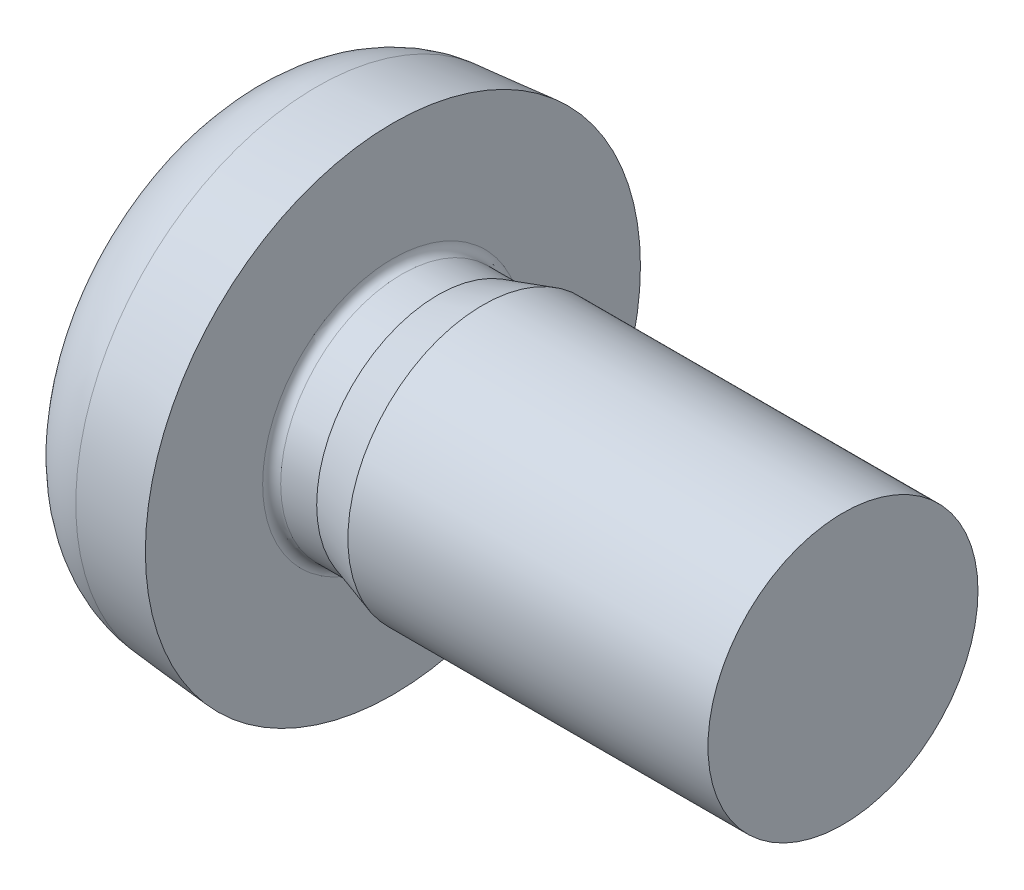
ISO-10303-21;
HEADER;
FILE_DESCRIPTION(('STEP AP214'),'2;1');
FILE_NAME('part.step','',(''),(''),'','','');
FILE_SCHEMA(('AUTOMOTIVE_DESIGN { 1 0 10303 214 1 1 1 1 }'));
ENDSEC;
DATA;
#1=APPLICATION_CONTEXT('core data for automotive mechanical design processes');
#2=APPLICATION_PROTOCOL_DEFINITION('international standard','automotive_design',2000,#1);
#3=PRODUCT_CONTEXT('',#1,'mechanical');
#4=PRODUCT('Part','Part','',(#3));
#5=PRODUCT_RELATED_PRODUCT_CATEGORY('part','',(#4));
#6=PRODUCT_DEFINITION_FORMATION('','',#4);
#7=PRODUCT_DEFINITION_CONTEXT('part definition',#1,'design');
#8=PRODUCT_DEFINITION('design','',#6,#7);
#9=PRODUCT_DEFINITION_SHAPE('','',#8);
#10=(LENGTH_UNIT() NAMED_UNIT(*) SI_UNIT(.MILLI.,.METRE.));
#11=(NAMED_UNIT(*) PLANE_ANGLE_UNIT() SI_UNIT($,.RADIAN.));
#12=(NAMED_UNIT(*) SI_UNIT($,.STERADIAN.) SOLID_ANGLE_UNIT());
#13=UNCERTAINTY_MEASURE_WITH_UNIT(LENGTH_MEASURE(1.E-05),#10,'distance_accuracy_value','');
#14=(GEOMETRIC_REPRESENTATION_CONTEXT(3) GLOBAL_UNCERTAINTY_ASSIGNED_CONTEXT((#13)) GLOBAL_UNIT_ASSIGNED_CONTEXT((#10,
#11,#12)) REPRESENTATION_CONTEXT('',''));
#15=CARTESIAN_POINT('',(0.,0.,0.));
#16=DIRECTION('',(0.,0.,1.));
#17=DIRECTION('',(1.,0.,0.));
#18=AXIS2_PLACEMENT_3D('',#15,#16,#17);
#19=CARTESIAN_POINT('',(-1.,0.,0.));
#20=DIRECTION('',(1.,0.,0.));
#21=DIRECTION('',(0.,0.,-1.));
#22=AXIS2_PLACEMENT_3D('',#19,#20,#21);
#23=PLANE('',#22);
#24=DIRECTION('',(0.,-1.,0.));
#25=VECTOR('',#24,1.);
#26=CARTESIAN_POINT('',(-1.,0.916666666666667,0.36666666666666));
#27=LINE('',#26,#25);
#28=CARTESIAN_POINT('',(-1.,0.916666666666667,0.36666666666666));
#29=VERTEX_POINT('',#28);
#30=CARTESIAN_POINT('',(-1.,1.8,0.36666666666666));
#31=VERTEX_POINT('',#30);
#32=EDGE_CURVE('E152',#29,#31,#27,.F.);
#33=ORIENTED_EDGE('',*,*,#32,.T.);
#34=DIRECTION('',(0.,0.,1.));
#35=VECTOR('',#34,1.);
#36=CARTESIAN_POINT('',(-1.,1.8,0.36666666666666));
#37=LINE('',#36,#35);
#38=CARTESIAN_POINT('',(-1.,1.8,-0.366666666666681));
#39=VERTEX_POINT('',#38);
#40=EDGE_CURVE('E147',#31,#39,#37,.F.);
#41=ORIENTED_EDGE('',*,*,#40,.T.);
#42=DIRECTION('',(0.,1.,0.));
#43=VECTOR('',#42,1.);
#44=CARTESIAN_POINT('',(-1.,1.8,-0.366666666666681));
#45=LINE('',#44,#43);
#46=CARTESIAN_POINT('',(-1.,0.916666666666666,-0.366666666666682));
#47=VERTEX_POINT('',#46);
#48=EDGE_CURVE('E149',#39,#47,#45,.F.);
#49=ORIENTED_EDGE('',*,*,#48,.T.);
#50=CARTESIAN_POINT('',(-1.,0.916666666666666,-0.916666666666681));
#51=DIRECTION('',(-1.,0.,0.));
#52=DIRECTION('',(0.,0.,1.));
#53=AXIS2_PLACEMENT_3D('',#50,#51,#52);
#54=CIRCLE('',#53,0.55);
#55=CARTESIAN_POINT('',(-1.,0.366666666666667,-0.916666666666682));
#56=VERTEX_POINT('',#55);
#57=EDGE_CURVE('E179',#56,#47,#54,.T.);
#58=ORIENTED_EDGE('',*,*,#57,.F.);
#59=DIRECTION('',(0.,0.,1.));
#60=VECTOR('',#59,1.);
#61=CARTESIAN_POINT('',(-1.,0.366666666666667,-0.916666666666681));
#62=LINE('',#61,#60);
#63=CARTESIAN_POINT('',(-1.,0.366666666666667,-1.8));
#64=VERTEX_POINT('',#63);
#65=EDGE_CURVE('E182',#56,#64,#62,.F.);
#66=ORIENTED_EDGE('',*,*,#65,.T.);
#67=DIRECTION('',(0.,1.,0.));
#68=VECTOR('',#67,1.);
#69=CARTESIAN_POINT('',(-1.,0.366666666666666,-1.8));
#70=LINE('',#69,#68);
#71=CARTESIAN_POINT('',(-1.,-0.366666666666667,-1.8));
#72=VERTEX_POINT('',#71);
#73=EDGE_CURVE('E129',#64,#72,#70,.F.);
#74=ORIENTED_EDGE('',*,*,#73,.T.);
#75=DIRECTION('',(0.,0.,-1.));
#76=VECTOR('',#75,1.);
#77=CARTESIAN_POINT('',(-1.,-0.366666666666667,-1.8));
#78=LINE('',#77,#76);
#79=CARTESIAN_POINT('',(-1.,-0.366666666666667,-0.916666666666681));
#80=VERTEX_POINT('',#79);
#81=EDGE_CURVE('E125',#72,#80,#78,.F.);
#82=ORIENTED_EDGE('',*,*,#81,.T.);
#83=CARTESIAN_POINT('',(-1.,-0.916666666666667,-0.916666666666681));
#84=DIRECTION('',(-1.,0.,0.));
#85=DIRECTION('',(0.,0.,1.));
#86=AXIS2_PLACEMENT_3D('',#83,#84,#85);
#87=CIRCLE('',#86,0.55);
#88=CARTESIAN_POINT('',(-1.,-0.916666666666667,-0.366666666666681));
#89=VERTEX_POINT('',#88);
#90=EDGE_CURVE('E21',#89,#80,#87,.T.);
#91=ORIENTED_EDGE('',*,*,#90,.F.);
#92=DIRECTION('',(0.,1.,0.));
#93=VECTOR('',#92,1.);
#94=CARTESIAN_POINT('',(-1.,-0.916666666666666,-0.366666666666681));
#95=LINE('',#94,#93);
#96=CARTESIAN_POINT('',(-1.,-1.8,-0.366666666666681));
#97=VERTEX_POINT('',#96);
#98=EDGE_CURVE('E133',#89,#97,#95,.F.);
#99=ORIENTED_EDGE('',*,*,#98,.T.);
#100=DIRECTION('',(0.,0.,-1.));
#101=VECTOR('',#100,1.);
#102=CARTESIAN_POINT('',(-1.,-1.8,-0.366666666666681));
#103=LINE('',#102,#101);
#104=CARTESIAN_POINT('',(-1.,-1.8,0.366666666666667));
#105=VERTEX_POINT('',#104);
#106=EDGE_CURVE('E137',#97,#105,#103,.F.);
#107=ORIENTED_EDGE('',*,*,#106,.T.);
#108=DIRECTION('',(0.,-1.,0.));
#109=VECTOR('',#108,1.);
#110=CARTESIAN_POINT('',(-1.,-1.8,0.366666666666667));
#111=LINE('',#110,#109);
#112=CARTESIAN_POINT('',(-1.,-0.916666666666668,0.366666666666667));
#113=VERTEX_POINT('',#112);
#114=EDGE_CURVE('E190',#105,#113,#111,.F.);
#115=ORIENTED_EDGE('',*,*,#114,.T.);
#116=CARTESIAN_POINT('',(-1.,-0.916666666666668,0.916666666666667));
#117=DIRECTION('',(-1.,0.,0.));
#118=DIRECTION('',(0.,0.,1.));
#119=AXIS2_PLACEMENT_3D('',#116,#117,#118);
#120=CIRCLE('',#119,0.55);
#121=CARTESIAN_POINT('',(-1.,-0.366666666666667,0.916666666666667));
#122=VERTEX_POINT('',#121);
#123=EDGE_CURVE('E328',#122,#113,#120,.T.);
#124=ORIENTED_EDGE('',*,*,#123,.F.);
#125=DIRECTION('',(0.,0.,-1.));
#126=VECTOR('',#125,1.);
#127=CARTESIAN_POINT('',(-1.,-0.366666666666667,0.916666666666667));
#128=LINE('',#127,#126);
#129=CARTESIAN_POINT('',(-1.,-0.366666666666667,1.8));
#130=VERTEX_POINT('',#129);
#131=EDGE_CURVE('E198',#122,#130,#128,.F.);
#132=ORIENTED_EDGE('',*,*,#131,.T.);
#133=DIRECTION('',(0.,1.,0.));
#134=VECTOR('',#133,1.);
#135=CARTESIAN_POINT('',(-1.,-0.366666666666667,1.8));
#136=LINE('',#135,#134);
#137=CARTESIAN_POINT('',(-1.,0.366666666666667,1.8));
#138=VERTEX_POINT('',#137);
#139=EDGE_CURVE('E202',#130,#138,#136,.T.);
#140=ORIENTED_EDGE('',*,*,#139,.T.);
#141=DIRECTION('',(0.,0.,1.));
#142=VECTOR('',#141,1.);
#143=CARTESIAN_POINT('',(-1.,0.366666666666667,1.8));
#144=LINE('',#143,#142);
#145=CARTESIAN_POINT('',(-1.,0.366666666666667,0.91666666666666));
#146=VERTEX_POINT('',#145);
#147=EDGE_CURVE('E205',#138,#146,#144,.F.);
#148=ORIENTED_EDGE('',*,*,#147,.T.);
#149=CARTESIAN_POINT('',(-1.,0.916666666666667,0.91666666666666));
#150=DIRECTION('',(-1.,0.,0.));
#151=DIRECTION('',(0.,0.,1.));
#152=AXIS2_PLACEMENT_3D('',#149,#150,#151);
#153=CIRCLE('',#152,0.55);
#154=EDGE_CURVE('E331',#29,#146,#153,.T.);
#155=ORIENTED_EDGE('',*,*,#154,.F.);
#156=EDGE_LOOP('',(#33,#41,#49,#58,#66,#74,#82,#91,#99,#107,#115,#124,#132,#140,#148,#155));
#157=FACE_BOUND('',#156,.T.);
#158=ADVANCED_FACE('F17',(#157),#23,.F.);
#159=CARTESIAN_POINT('',(-2.,-0.916666666666666,-0.366666666666681));
#160=DIRECTION('',(0.,0.,-1.));
#161=DIRECTION('',(0.,1.,0.));
#162=AXIS2_PLACEMENT_3D('',#159,#160,#161);
#163=PLANE('',#162);
#164=ORIENTED_EDGE('',*,*,#98,.F.);
#165=DIRECTION('',(-1.,0.,0.));
#166=VECTOR('',#165,1.);
#167=CARTESIAN_POINT('',(-2.,-0.916666666666667,-0.366666666666681));
#168=LINE('',#167,#166);
#169=CARTESIAN_POINT('',(-1.93002725664033,-0.916666666666667,-0.366666666666681));
#170=VERTEX_POINT('',#169);
#171=EDGE_CURVE('E187',#170,#89,#168,.F.);
#172=ORIENTED_EDGE('',*,*,#171,.F.);
#173=CARTESIAN_POINT('',(5.,0.,-0.366666666666682));
#174=DIRECTION('',(0.,0.,-1.));
#175=DIRECTION('',(0.,1.,0.));
#176=AXIS2_PLACEMENT_3D('',#173,#174,#175);
#177=CIRCLE('',#176,6.99039022913282);
#178=CARTESIAN_POINT('',(-1.75466916699521,-1.8,-0.366666666666681));
#179=VERTEX_POINT('',#178);
#180=EDGE_CURVE('E325',#179,#170,#177,.T.);
#181=ORIENTED_EDGE('',*,*,#180,.F.);
#182=DIRECTION('',(1.,0.,0.));
#183=VECTOR('',#182,1.);
#184=CARTESIAN_POINT('',(-2.,-1.8,-0.366666666666681));
#185=LINE('',#184,#183);
#186=EDGE_CURVE('E196',#179,#97,#185,.T.);
#187=ORIENTED_EDGE('',*,*,#186,.T.);
#188=EDGE_LOOP('',(#164,#172,#181,#187));
#189=FACE_BOUND('',#188,.T.);
#190=ADVANCED_FACE('F313',(#189),#163,.F.);
#191=CARTESIAN_POINT('',(-2.,-0.916666666666667,-0.916666666666681));
#192=DIRECTION('',(-1.,0.,0.));
#193=DIRECTION('',(0.,0.,1.));
#194=AXIS2_PLACEMENT_3D('',#191,#192,#193);
#195=CYLINDRICAL_SURFACE('',#194,0.55);
#196=CARTESIAN_POINT('',(-1.93002725664033,-0.916666666666667,-0.366666666666681));
#197=CARTESIAN_POINT('',(-1.93407227520159,-0.886112931984949,-0.366639615190067));
#198=CARTESIAN_POINT('',(-1.93777603133214,-0.855514124884462,-0.369211391563301));
#199=CARTESIAN_POINT('',(-1.94440928453483,-0.795093223472977,-0.379404826816264));
#200=CARTESIAN_POINT('',(-1.94733902252033,-0.765270890095668,-0.387024911812327));
#201=CARTESIAN_POINT('',(-1.95233727765501,-0.70722484857691,-0.40717597839749));
#202=CARTESIAN_POINT('',(-1.95440505540861,-0.679002530794038,-0.419711158378407));
#203=CARTESIAN_POINT('',(-1.9576137344238,-0.625019695178207,-0.449345372281648));
#204=CARTESIAN_POINT('',(-1.95875496666875,-0.599258301150878,-0.466442773571219));
#205=CARTESIAN_POINT('',(-1.96007037465317,-0.551169619490936,-0.504544762148184));
#206=CARTESIAN_POINT('',(-1.96025340503453,-0.528812748649267,-0.525511713742623));
#207=CARTESIAN_POINT('',(-1.95967070187186,-0.487888718635724,-0.570860022678963));
#208=CARTESIAN_POINT('',(-1.95890483538137,-0.469322090925454,-0.595241858043158));
#209=CARTESIAN_POINT('',(-1.95645267839,-0.436572958940025,-0.646603315629529));
#210=CARTESIAN_POINT('',(-1.95477018770261,-0.422372731585471,-0.673571837209157));
#211=CARTESIAN_POINT('',(-1.95053673130942,-0.39863303654964,-0.729421048067446));
#212=CARTESIAN_POINT('',(-1.94798604435116,-0.389092075331408,-0.758301121219216));
#213=CARTESIAN_POINT('',(-1.94292201050267,-0.376895672956433,-0.808864676990656));
#214=CARTESIAN_POINT('',(-1.94059943504869,-0.373058918267392,-0.830290913023339));
#215=CARTESIAN_POINT('',(-1.93558325865533,-0.36794402974454,-0.873372349629094));
#216=CARTESIAN_POINT('',(-1.93289019461072,-0.366662234278177,-0.895027177754611));
#217=CARTESIAN_POINT('',(-1.93002725664033,-0.366666666666667,-0.916666666666682));
#218=B_SPLINE_CURVE_WITH_KNOTS('',3,(#196,#197,#198,#199,#200,#201,#202,#203,#204,#205,#206,
#207,#208,#209,#210,#211,#212,#213,#214,#215,#216,#217),.UNSPECIFIED.,.F.,.F.,(4,2,2,2,2,2,2,2,
2,2,4),(0.,0.0923521249425688,0.184675471307177,0.27707785112806,0.369447208153474,
0.460961463533269,0.552488542089664,0.643639055842369,0.734760331907433,0.800285720426181,
0.865717133706987),.UNSPECIFIED.);
#219=CARTESIAN_POINT('',(-1.93002725664033,-0.366666666666667,-0.916666666666682));
#220=VERTEX_POINT('',#219);
#221=EDGE_CURVE('E316',#170,#220,#218,.T.);
#222=ORIENTED_EDGE('',*,*,#221,.F.);
#223=ORIENTED_EDGE('',*,*,#171,.T.);
#224=ORIENTED_EDGE('',*,*,#90,.T.);
#225=DIRECTION('',(1.,0.,0.));
#226=VECTOR('',#225,1.);
#227=CARTESIAN_POINT('',(-2.,-0.366666666666667,-0.916666666666681));
#228=LINE('',#227,#226);
#229=EDGE_CURVE('E185',#80,#220,#228,.F.);
#230=ORIENTED_EDGE('',*,*,#229,.T.);
#231=EDGE_LOOP('',(#222,#223,#224,#230));
#232=FACE_BOUND('',#231,.T.);
#233=ADVANCED_FACE('F308',(#232),#195,.T.);
#234=CARTESIAN_POINT('',(-2.,-0.366666666666667,-1.8));
#235=DIRECTION('',(0.,-1.,0.));
#236=DIRECTION('',(0.,0.,-1.));
#237=AXIS2_PLACEMENT_3D('',#234,#235,#236);
#238=PLANE('',#237);
#239=ORIENTED_EDGE('',*,*,#81,.F.);
#240=DIRECTION('',(-1.,0.,0.));
#241=VECTOR('',#240,1.);
#242=CARTESIAN_POINT('',(-2.,-0.366666666666667,-1.8));
#243=LINE('',#242,#241);
#244=CARTESIAN_POINT('',(-1.75466916699521,-0.366666666666667,-1.8));
#245=VERTEX_POINT('',#244);
#246=EDGE_CURVE('E183',#72,#245,#243,.T.);
#247=ORIENTED_EDGE('',*,*,#246,.T.);
#248=CARTESIAN_POINT('',(5.,-0.366666666666667,0.));
#249=DIRECTION('',(0.,-1.,0.));
#250=DIRECTION('',(0.,0.,-1.));
#251=AXIS2_PLACEMENT_3D('',#248,#249,#250);
#252=CIRCLE('',#251,6.99039022913282);
#253=EDGE_CURVE('E324',#220,#245,#252,.T.);
#254=ORIENTED_EDGE('',*,*,#253,.F.);
#255=ORIENTED_EDGE('',*,*,#229,.F.);
#256=EDGE_LOOP('',(#239,#247,#254,#255));
#257=FACE_BOUND('',#256,.T.);
#258=ADVANCED_FACE('F304',(#257),#238,.F.);
#259=CARTESIAN_POINT('',(-2.,0.366666666666666,-1.8));
#260=DIRECTION('',(0.,0.,-1.));
#261=DIRECTION('',(-1.,0.,0.));
#262=AXIS2_PLACEMENT_3D('',#259,#260,#261);
#263=PLANE('',#262);
#264=ORIENTED_EDGE('',*,*,#73,.F.);
#265=DIRECTION('',(1.,0.,0.));
#266=VECTOR('',#265,1.);
#267=CARTESIAN_POINT('',(-2.,0.366666666666667,-1.8));
#268=LINE('',#267,#266);
#269=CARTESIAN_POINT('',(-1.75466916699521,0.366666666666667,-1.8));
#270=VERTEX_POINT('',#269);
#271=EDGE_CURVE('E180',#64,#270,#268,.F.);
#272=ORIENTED_EDGE('',*,*,#271,.T.);
#273=CARTESIAN_POINT('',(5.,0.,-1.8));
#274=DIRECTION('',(0.,0.,-1.));
#275=DIRECTION('',(-1.,0.,0.));
#276=AXIS2_PLACEMENT_3D('',#273,#274,#275);
#277=CIRCLE('',#276,6.76461381011511);
#278=EDGE_CURVE('E341',#245,#270,#277,.T.);
#279=ORIENTED_EDGE('',*,*,#278,.F.);
#280=ORIENTED_EDGE('',*,*,#246,.F.);
#281=EDGE_LOOP('',(#264,#272,#279,#280));
#282=FACE_BOUND('',#281,.T.);
#283=ADVANCED_FACE('F300',(#282),#263,.F.);
#284=CARTESIAN_POINT('',(-2.,0.366666666666667,-0.916666666666681));
#285=DIRECTION('',(0.,1.,0.));
#286=DIRECTION('',(0.,0.,1.));
#287=AXIS2_PLACEMENT_3D('',#284,#285,#286);
#288=PLANE('',#287);
#289=ORIENTED_EDGE('',*,*,#65,.F.);
#290=DIRECTION('',(-1.,0.,0.));
#291=VECTOR('',#290,1.);
#292=CARTESIAN_POINT('',(-2.,0.366666666666667,-0.916666666666682));
#293=LINE('',#292,#291);
#294=CARTESIAN_POINT('',(-1.93002725664033,0.366666666666667,-0.916666666666682));
#295=VERTEX_POINT('',#294);
#296=EDGE_CURVE('E165',#295,#56,#293,.F.);
#297=ORIENTED_EDGE('',*,*,#296,.F.);
#298=CARTESIAN_POINT('',(5.,0.366666666666667,0.));
#299=DIRECTION('',(0.,1.,0.));
#300=DIRECTION('',(0.,0.,1.));
#301=AXIS2_PLACEMENT_3D('',#298,#299,#300);
#302=CIRCLE('',#301,6.99039022913282);
#303=EDGE_CURVE('E287',#270,#295,#302,.T.);
#304=ORIENTED_EDGE('',*,*,#303,.F.);
#305=ORIENTED_EDGE('',*,*,#271,.F.);
#306=EDGE_LOOP('',(#289,#297,#304,#305));
#307=FACE_BOUND('',#306,.T.);
#308=ADVANCED_FACE('F296',(#307),#288,.F.);
#309=CARTESIAN_POINT('',(-2.,0.916666666666666,-0.916666666666681));
#310=DIRECTION('',(-1.,0.,0.));
#311=DIRECTION('',(0.,0.,1.));
#312=AXIS2_PLACEMENT_3D('',#309,#310,#311);
#313=CYLINDRICAL_SURFACE('',#312,0.55);
#314=CARTESIAN_POINT('',(-1.93002725664033,0.366666666666667,-0.916666666666683));
#315=CARTESIAN_POINT('',(-1.93407227520159,0.366639615190052,-0.886112931984965));
#316=CARTESIAN_POINT('',(-1.93777603133214,0.369211391563286,-0.855514124884478));
#317=CARTESIAN_POINT('',(-1.94440928453483,0.379404826816249,-0.795093223472993));
#318=CARTESIAN_POINT('',(-1.94733902252033,0.387024911812312,-0.765270890095684));
#319=CARTESIAN_POINT('',(-1.95233727765501,0.407175978397476,-0.707224848576926));
#320=CARTESIAN_POINT('',(-1.95440505540861,0.419711158378392,-0.679002530794054));
#321=CARTESIAN_POINT('',(-1.9576137344238,0.449345372281632,-0.625019695178223));
#322=CARTESIAN_POINT('',(-1.95875496666875,0.466442773571205,-0.599258301150894));
#323=CARTESIAN_POINT('',(-1.96007037465317,0.504544762148169,-0.551169619490952));
#324=CARTESIAN_POINT('',(-1.96025340503453,0.525511713742607,-0.528812748649282));
#325=CARTESIAN_POINT('',(-1.95967070187186,0.570860022678947,-0.487888718635738));
#326=CARTESIAN_POINT('',(-1.95890483538137,0.595241858043142,-0.46932209092547));
#327=CARTESIAN_POINT('',(-1.95645267839,0.646603315629514,-0.43657295894004));
#328=CARTESIAN_POINT('',(-1.95477018770261,0.673571837209142,-0.422372731585486));
#329=CARTESIAN_POINT('',(-1.95053673130942,0.72942104806743,-0.398633036549654));
#330=CARTESIAN_POINT('',(-1.94798604435116,0.758301121219201,-0.389092075331423));
#331=CARTESIAN_POINT('',(-1.94292201050267,0.808864676990641,-0.376895672956448));
#332=CARTESIAN_POINT('',(-1.94059943504869,0.830290913023323,-0.373058918267406));
#333=CARTESIAN_POINT('',(-1.93558325865533,0.873372349629079,-0.367944029744553));
#334=CARTESIAN_POINT('',(-1.93289019461073,0.895027177754596,-0.36666223427819));
#335=CARTESIAN_POINT('',(-1.93002725664033,0.916666666666667,-0.366666666666682));
#336=B_SPLINE_CURVE_WITH_KNOTS('',3,(#314,#315,#316,#317,#318,#319,#320,#321,#322,#323,#324,
#325,#326,#327,#328,#329,#330,#331,#332,#333,#334,#335),.UNSPECIFIED.,.F.,.F.,(4,2,2,2,2,2,2,2,
2,2,4),(0.,0.0923521249425694,0.184675471307178,0.27707785112806,0.369447208153474,
0.460961463533269,0.552488542089666,0.64363905584237,0.734760331907434,0.800285720426182,
0.865717133706989),.UNSPECIFIED.);
#337=CARTESIAN_POINT('',(-1.93002725664033,0.916666666666666,-0.366666666666682));
#338=VERTEX_POINT('',#337);
#339=EDGE_CURVE('E279',#295,#338,#336,.T.);
#340=ORIENTED_EDGE('',*,*,#339,.F.);
#341=ORIENTED_EDGE('',*,*,#296,.T.);
#342=ORIENTED_EDGE('',*,*,#57,.T.);
#343=DIRECTION('',(1.,0.,0.));
#344=VECTOR('',#343,1.);
#345=CARTESIAN_POINT('',(-2.,0.916666666666666,-0.366666666666682));
#346=LINE('',#345,#344);
#347=EDGE_CURVE('E157',#47,#338,#346,.F.);
#348=ORIENTED_EDGE('',*,*,#347,.T.);
#349=EDGE_LOOP('',(#340,#341,#342,#348));
#350=FACE_BOUND('',#349,.T.);
#351=ADVANCED_FACE('F291',(#350),#313,.T.);
#352=CARTESIAN_POINT('',(-2.,1.8,-0.366666666666681));
#353=DIRECTION('',(0.,0.,-1.));
#354=DIRECTION('',(0.,1.,0.));
#355=AXIS2_PLACEMENT_3D('',#352,#353,#354);
#356=PLANE('',#355);
#357=ORIENTED_EDGE('',*,*,#48,.F.);
#358=DIRECTION('',(1.,0.,0.));
#359=VECTOR('',#358,1.);
#360=CARTESIAN_POINT('',(-2.,1.8,-0.366666666666681));
#361=LINE('',#360,#359);
#362=CARTESIAN_POINT('',(-1.75466916699521,1.8,-0.366666666666681));
#363=VERTEX_POINT('',#362);
#364=EDGE_CURVE('E156',#39,#363,#361,.F.);
#365=ORIENTED_EDGE('',*,*,#364,.T.);
#366=CARTESIAN_POINT('',(5.,0.,-0.366666666666682));
#367=DIRECTION('',(0.,0.,-1.));
#368=DIRECTION('',(0.,1.,0.));
#369=AXIS2_PLACEMENT_3D('',#366,#367,#368);
#370=CIRCLE('',#369,6.99039022913282);
#371=EDGE_CURVE('E277',#338,#363,#370,.T.);
#372=ORIENTED_EDGE('',*,*,#371,.F.);
#373=ORIENTED_EDGE('',*,*,#347,.F.);
#374=EDGE_LOOP('',(#357,#365,#372,#373));
#375=FACE_BOUND('',#374,.T.);
#376=ADVANCED_FACE('F162',(#375),#356,.F.);
#377=CARTESIAN_POINT('',(-2.,1.8,0.36666666666666));
#378=DIRECTION('',(0.,1.,0.));
#379=DIRECTION('',(0.,0.,1.));
#380=AXIS2_PLACEMENT_3D('',#377,#378,#379);
#381=PLANE('',#380);
#382=ORIENTED_EDGE('',*,*,#40,.F.);
#383=DIRECTION('',(1.,0.,0.));
#384=VECTOR('',#383,1.);
#385=CARTESIAN_POINT('',(-2.,1.8,0.36666666666666));
#386=LINE('',#385,#384);
#387=CARTESIAN_POINT('',(-1.75466916699521,1.8,0.36666666666666));
#388=VERTEX_POINT('',#387);
#389=EDGE_CURVE('E171',#31,#388,#386,.F.);
#390=ORIENTED_EDGE('',*,*,#389,.T.);
#391=CARTESIAN_POINT('',(5.00000000000011,1.8,0.));
#392=DIRECTION('',(0.,1.,0.));
#393=DIRECTION('',(0.,0.,1.));
#394=AXIS2_PLACEMENT_3D('',#391,#392,#393);
#395=CIRCLE('',#394,6.76461381011523);
#396=EDGE_CURVE('E169',#363,#388,#395,.T.);
#397=ORIENTED_EDGE('',*,*,#396,.F.);
#398=ORIENTED_EDGE('',*,*,#364,.F.);
#399=EDGE_LOOP('',(#382,#390,#397,#398));
#400=FACE_BOUND('',#399,.T.);
#401=ADVANCED_FACE('F167',(#400),#381,.F.);
#402=CARTESIAN_POINT('',(-2.,0.916666666666667,0.36666666666666));
#403=DIRECTION('',(0.,0.,1.));
#404=DIRECTION('',(0.,-1.,0.));
#405=AXIS2_PLACEMENT_3D('',#402,#403,#404);
#406=PLANE('',#405);
#407=ORIENTED_EDGE('',*,*,#32,.F.);
#408=DIRECTION('',(-1.,0.,0.));
#409=VECTOR('',#408,1.);
#410=CARTESIAN_POINT('',(-2.,0.916666666666667,0.36666666666666));
#411=LINE('',#410,#409);
#412=CARTESIAN_POINT('',(-1.93002725664033,0.916666666666667,0.36666666666666));
#413=VERTEX_POINT('',#412);
#414=EDGE_CURVE('E206',#413,#29,#411,.F.);
#415=ORIENTED_EDGE('',*,*,#414,.F.);
#416=CARTESIAN_POINT('',(5.00000000000011,0.,0.36666666666666));
#417=DIRECTION('',(0.,0.,1.));
#418=DIRECTION('',(0.,-1.,0.));
#419=AXIS2_PLACEMENT_3D('',#416,#417,#418);
#420=CIRCLE('',#419,6.99039022913294);
#421=EDGE_CURVE('E273',#388,#413,#420,.T.);
#422=ORIENTED_EDGE('',*,*,#421,.F.);
#423=ORIENTED_EDGE('',*,*,#389,.F.);
#424=EDGE_LOOP('',(#407,#415,#422,#423));
#425=FACE_BOUND('',#424,.T.);
#426=ADVANCED_FACE('F260',(#425),#406,.F.);
#427=CARTESIAN_POINT('',(-2.,0.916666666666667,0.91666666666666));
#428=DIRECTION('',(-1.,0.,0.));
#429=DIRECTION('',(0.,0.,1.));
#430=AXIS2_PLACEMENT_3D('',#427,#428,#429);
#431=CYLINDRICAL_SURFACE('',#430,0.55);
#432=CARTESIAN_POINT('',(-1.93002725664033,0.916666666666667,0.36666666666666));
#433=CARTESIAN_POINT('',(-1.9340722752016,0.88611293198495,0.366639615190046));
#434=CARTESIAN_POINT('',(-1.93777603133215,0.855514124884463,0.36921139156328));
#435=CARTESIAN_POINT('',(-1.94440928453484,0.795093223472977,0.379404826816243));
#436=CARTESIAN_POINT('',(-1.94733902252033,0.765270890095667,0.387024911812306));
#437=CARTESIAN_POINT('',(-1.95233727765502,0.707224848576909,0.40717597839747));
#438=CARTESIAN_POINT('',(-1.95440505540862,0.679002530794038,0.419711158378386));
#439=CARTESIAN_POINT('',(-1.95761373442381,0.625019695178207,0.449345372281627));
#440=CARTESIAN_POINT('',(-1.95875496666876,0.599258301150878,0.466442773571199));
#441=CARTESIAN_POINT('',(-1.96007037465318,0.551169619490936,0.504544762148164));
#442=CARTESIAN_POINT('',(-1.96025340503454,0.528812748649267,0.525511713742603));
#443=CARTESIAN_POINT('',(-1.95967070187187,0.487888718635723,0.570860022678943));
#444=CARTESIAN_POINT('',(-1.95890483538137,0.469322090925453,0.595241858043137));
#445=CARTESIAN_POINT('',(-1.95645267839,0.436572958940024,0.646603315629509));
#446=CARTESIAN_POINT('',(-1.95477018770262,0.42237273158547,0.673571837209139));
#447=CARTESIAN_POINT('',(-1.95053673130943,0.398633036549639,0.729421048067427));
#448=CARTESIAN_POINT('',(-1.94798604435116,0.389092075331407,0.758301121219197));
#449=CARTESIAN_POINT('',(-1.94292201050267,0.376895672956433,0.808864676990637));
#450=CARTESIAN_POINT('',(-1.9405994350487,0.373058918267391,0.83029091302332));
#451=CARTESIAN_POINT('',(-1.93558325865534,0.367944029744539,0.873372349629075));
#452=CARTESIAN_POINT('',(-1.93289019461074,0.366662234278176,0.895027177754592));
#453=CARTESIAN_POINT('',(-1.93002725664033,0.366666666666667,0.916666666666661));
#454=B_SPLINE_CURVE_WITH_KNOTS('',3,(#432,#433,#434,#435,#436,#437,#438,#439,#440,#441,#442,
#443,#444,#445,#446,#447,#448,#449,#450,#451,#452,#453),.UNSPECIFIED.,.F.,.F.,(4,2,2,2,2,2,2,2,
2,2,4),(0.,0.0923521249425699,0.184675471307179,0.277077851128061,0.369447208153475,
0.46096146353327,0.552488542089667,0.643639055842372,0.734760331907437,0.800285720426183,
0.865717133706988),.UNSPECIFIED.);
#455=CARTESIAN_POINT('',(-1.93002725664033,0.366666666666667,0.91666666666666));
#456=VERTEX_POINT('',#455);
#457=EDGE_CURVE('E264',#413,#456,#454,.T.);
#458=ORIENTED_EDGE('',*,*,#457,.F.);
#459=ORIENTED_EDGE('',*,*,#414,.T.);
#460=ORIENTED_EDGE('',*,*,#154,.T.);
#461=DIRECTION('',(1.,0.,0.));
#462=VECTOR('',#461,1.);
#463=CARTESIAN_POINT('',(-2.,0.366666666666667,0.91666666666666));
#464=LINE('',#463,#462);
#465=EDGE_CURVE('E204',#146,#456,#464,.F.);
#466=ORIENTED_EDGE('',*,*,#465,.T.);
#467=EDGE_LOOP('',(#458,#459,#460,#466));
#468=FACE_BOUND('',#467,.T.);
#469=ADVANCED_FACE('F255',(#468),#431,.T.);
#470=CARTESIAN_POINT('',(-2.,0.366666666666667,1.8));
#471=DIRECTION('',(0.,1.,0.));
#472=DIRECTION('',(0.,0.,1.));
#473=AXIS2_PLACEMENT_3D('',#470,#471,#472);
#474=PLANE('',#473);
#475=ORIENTED_EDGE('',*,*,#147,.F.);
#476=DIRECTION('',(1.,0.,0.));
#477=VECTOR('',#476,1.);
#478=CARTESIAN_POINT('',(-2.,0.366666666666667,1.8));
#479=LINE('',#478,#477);
#480=CARTESIAN_POINT('',(-1.75466916699521,0.366666666666667,1.8));
#481=VERTEX_POINT('',#480);
#482=EDGE_CURVE('E201',#138,#481,#479,.F.);
#483=ORIENTED_EDGE('',*,*,#482,.T.);
#484=CARTESIAN_POINT('',(5.00000000000011,0.366666666666667,0.));
#485=DIRECTION('',(0.,1.,0.));
#486=DIRECTION('',(0.,0.,1.));
#487=AXIS2_PLACEMENT_3D('',#484,#485,#486);
#488=CIRCLE('',#487,6.99039022913294);
#489=EDGE_CURVE('E272',#456,#481,#488,.T.);
#490=ORIENTED_EDGE('',*,*,#489,.F.);
#491=ORIENTED_EDGE('',*,*,#465,.F.);
#492=EDGE_LOOP('',(#475,#483,#490,#491));
#493=FACE_BOUND('',#492,.T.);
#494=ADVANCED_FACE('F251',(#493),#474,.F.);
#495=CARTESIAN_POINT('',(-2.,-0.366666666666667,1.8));
#496=DIRECTION('',(0.,0.,1.));
#497=DIRECTION('',(1.,0.,0.));
#498=AXIS2_PLACEMENT_3D('',#495,#496,#497);
#499=PLANE('',#498);
#500=ORIENTED_EDGE('',*,*,#139,.F.);
#501=DIRECTION('',(1.,0.,0.));
#502=VECTOR('',#501,1.);
#503=CARTESIAN_POINT('',(-2.,-0.366666666666667,1.8));
#504=LINE('',#503,#502);
#505=CARTESIAN_POINT('',(-1.75466916699521,-0.366666666666667,1.8));
#506=VERTEX_POINT('',#505);
#507=EDGE_CURVE('E200',#130,#506,#504,.F.);
#508=ORIENTED_EDGE('',*,*,#507,.T.);
#509=CARTESIAN_POINT('',(5.00000000000011,0.,1.8));
#510=DIRECTION('',(0.,0.,1.));
#511=DIRECTION('',(1.,0.,0.));
#512=AXIS2_PLACEMENT_3D('',#509,#510,#511);
#513=CIRCLE('',#512,6.76461381011523);
#514=EDGE_CURVE('E381',#481,#506,#513,.T.);
#515=ORIENTED_EDGE('',*,*,#514,.F.);
#516=ORIENTED_EDGE('',*,*,#482,.F.);
#517=EDGE_LOOP('',(#500,#508,#515,#516));
#518=FACE_BOUND('',#517,.T.);
#519=ADVANCED_FACE('F247',(#518),#499,.F.);
#520=CARTESIAN_POINT('',(-2.,-0.366666666666667,0.916666666666667));
#521=DIRECTION('',(0.,-1.,0.));
#522=DIRECTION('',(0.,0.,-1.));
#523=AXIS2_PLACEMENT_3D('',#520,#521,#522);
#524=PLANE('',#523);
#525=ORIENTED_EDGE('',*,*,#131,.F.);
#526=DIRECTION('',(-1.,0.,0.));
#527=VECTOR('',#526,1.);
#528=CARTESIAN_POINT('',(-2.,-0.366666666666667,0.916666666666667));
#529=LINE('',#528,#527);
#530=CARTESIAN_POINT('',(-1.93002725664033,-0.366666666666667,0.916666666666667));
#531=VERTEX_POINT('',#530);
#532=EDGE_CURVE('E193',#531,#122,#529,.F.);
#533=ORIENTED_EDGE('',*,*,#532,.F.);
#534=CARTESIAN_POINT('',(5.00000000000011,-0.366666666666667,0.));
#535=DIRECTION('',(0.,-1.,0.));
#536=DIRECTION('',(0.,0.,-1.));
#537=AXIS2_PLACEMENT_3D('',#534,#535,#536);
#538=CIRCLE('',#537,6.99039022913294);
#539=EDGE_CURVE('E231',#506,#531,#538,.T.);
#540=ORIENTED_EDGE('',*,*,#539,.F.);
#541=ORIENTED_EDGE('',*,*,#507,.F.);
#542=EDGE_LOOP('',(#525,#533,#540,#541));
#543=FACE_BOUND('',#542,.T.);
#544=ADVANCED_FACE('F242',(#543),#524,.F.);
#545=CARTESIAN_POINT('',(-2.,-0.916666666666668,0.916666666666667));
#546=DIRECTION('',(-1.,0.,0.));
#547=DIRECTION('',(0.,0.,1.));
#548=AXIS2_PLACEMENT_3D('',#545,#546,#547);
#549=CYLINDRICAL_SURFACE('',#548,0.55);
#550=CARTESIAN_POINT('',(-1.93002725664034,-0.366666666666667,0.916666666666668));
#551=CARTESIAN_POINT('',(-1.93407227520161,-0.366639615190054,0.886112931984951));
#552=CARTESIAN_POINT('',(-1.93777603133215,-0.369211391563288,0.855514124884464));
#553=CARTESIAN_POINT('',(-1.94440928453484,-0.37940482681625,0.795093223472978));
#554=CARTESIAN_POINT('',(-1.94733902252033,-0.387024911812313,0.765270890095668));
#555=CARTESIAN_POINT('',(-1.95233727765502,-0.407175978397477,0.70722484857691));
#556=CARTESIAN_POINT('',(-1.95440505540862,-0.419711158378394,0.679002530794039));
#557=CARTESIAN_POINT('',(-1.95761373442381,-0.449345372281635,0.625019695178207));
#558=CARTESIAN_POINT('',(-1.95875496666876,-0.466442773571205,0.599258301150877));
#559=CARTESIAN_POINT('',(-1.96007037465318,-0.50454476214817,0.551169619490935));
#560=CARTESIAN_POINT('',(-1.96025340503454,-0.52551171374261,0.528812748649267));
#561=CARTESIAN_POINT('',(-1.95967070187187,-0.570860022678951,0.487888718635724));
#562=CARTESIAN_POINT('',(-1.95890483538138,-0.595241858043144,0.469322090925453));
#563=CARTESIAN_POINT('',(-1.95645267839001,-0.646603315629516,0.436572958940024));
#564=CARTESIAN_POINT('',(-1.95477018770262,-0.673571837209146,0.422372731585471));
#565=CARTESIAN_POINT('',(-1.95053673130944,-0.729421048067434,0.398633036549639));
#566=CARTESIAN_POINT('',(-1.94798604435116,-0.758301121219204,0.389092075331407));
#567=CARTESIAN_POINT('',(-1.94292201050268,-0.808864676990644,0.376895672956432));
#568=CARTESIAN_POINT('',(-1.9405994350487,-0.830290913023327,0.373058918267391));
#569=CARTESIAN_POINT('',(-1.93558325865535,-0.873372349629082,0.36794402974454));
#570=CARTESIAN_POINT('',(-1.93289019461074,-0.895027177754599,0.366662234278176));
#571=CARTESIAN_POINT('',(-1.93002725664034,-0.916666666666668,0.366666666666666));
#572=B_SPLINE_CURVE_WITH_KNOTS('',3,(#550,#551,#552,#553,#554,#555,#556,#557,#558,#559,#560,
#561,#562,#563,#564,#565,#566,#567,#568,#569,#570,#571),.UNSPECIFIED.,.F.,.F.,(4,2,2,2,2,2,2,2,
2,2,4),(0.,0.0923521249425694,0.184675471307178,0.277077851128061,0.369447208153475,
0.46096146353327,0.552488542089667,0.643639055842372,0.734760331907437,0.800285720426183,
0.865717133706988),.UNSPECIFIED.);
#573=CARTESIAN_POINT('',(-1.93002725664033,-0.916666666666667,0.366666666666667));
#574=VERTEX_POINT('',#573);
#575=EDGE_CURVE('E222',#531,#574,#572,.T.);
#576=ORIENTED_EDGE('',*,*,#575,.F.);
#577=ORIENTED_EDGE('',*,*,#532,.T.);
#578=ORIENTED_EDGE('',*,*,#123,.T.);
#579=DIRECTION('',(1.,0.,0.));
#580=VECTOR('',#579,1.);
#581=CARTESIAN_POINT('',(-2.,-0.916666666666668,0.366666666666667));
#582=LINE('',#581,#580);
#583=EDGE_CURVE('E192',#113,#574,#582,.F.);
#584=ORIENTED_EDGE('',*,*,#583,.T.);
#585=EDGE_LOOP('',(#576,#577,#578,#584));
#586=FACE_BOUND('',#585,.T.);
#587=ADVANCED_FACE('F236',(#586),#549,.T.);
#588=CARTESIAN_POINT('',(-2.,-1.8,0.366666666666667));
#589=DIRECTION('',(0.,0.,1.));
#590=DIRECTION('',(0.,-1.,0.));
#591=AXIS2_PLACEMENT_3D('',#588,#589,#590);
#592=PLANE('',#591);
#593=ORIENTED_EDGE('',*,*,#114,.F.);
#594=DIRECTION('',(1.,0.,0.));
#595=VECTOR('',#594,1.);
#596=CARTESIAN_POINT('',(-2.,-1.8,0.366666666666667));
#597=LINE('',#596,#595);
#598=CARTESIAN_POINT('',(-1.75466916699522,-1.8,0.366666666666667));
#599=VERTEX_POINT('',#598);
#600=EDGE_CURVE('E195',#105,#599,#597,.F.);
#601=ORIENTED_EDGE('',*,*,#600,.T.);
#602=CARTESIAN_POINT('',(5.00000000000011,0.,0.366666666666667));
#603=DIRECTION('',(0.,0.,1.));
#604=DIRECTION('',(0.,-1.,0.));
#605=AXIS2_PLACEMENT_3D('',#602,#603,#604);
#606=CIRCLE('',#605,6.99039022913294);
#607=EDGE_CURVE('E219',#574,#599,#606,.T.);
#608=ORIENTED_EDGE('',*,*,#607,.F.);
#609=ORIENTED_EDGE('',*,*,#583,.F.);
#610=EDGE_LOOP('',(#593,#601,#608,#609));
#611=FACE_BOUND('',#610,.T.);
#612=ADVANCED_FACE('F241',(#611),#592,.F.);
#613=CARTESIAN_POINT('',(-2.,-1.8,-0.366666666666681));
#614=DIRECTION('',(0.,-1.,0.));
#615=DIRECTION('',(0.,0.,-1.));
#616=AXIS2_PLACEMENT_3D('',#613,#614,#615);
#617=PLANE('',#616);
#618=ORIENTED_EDGE('',*,*,#106,.F.);
#619=ORIENTED_EDGE('',*,*,#186,.F.);
#620=CARTESIAN_POINT('',(5.00000000000011,-1.8,0.));
#621=DIRECTION('',(0.,-1.,0.));
#622=DIRECTION('',(0.,0.,-1.));
#623=AXIS2_PLACEMENT_3D('',#620,#621,#622);
#624=CIRCLE('',#623,6.76461381011524);
#625=EDGE_CURVE('E216',#599,#179,#624,.T.);
#626=ORIENTED_EDGE('',*,*,#625,.F.);
#627=ORIENTED_EDGE('',*,*,#600,.F.);
#628=EDGE_LOOP('',(#618,#619,#626,#627));
#629=FACE_BOUND('',#628,.T.);
#630=ADVANCED_FACE('F353',(#629),#617,.F.);
#631=CARTESIAN_POINT('',(5.00000000000011,0.,0.));
#632=DIRECTION('',(1.,0.,0.));
#633=DIRECTION('',(0.,1.,0.));
#634=AXIS2_PLACEMENT_3D('',#631,#632,#633);
#635=SPHERICAL_SURFACE('',#634,7.00000000000012);
#636=CARTESIAN_POINT('',(-1.72010866348559,0.,0.));
#637=DIRECTION('',(1.,0.,0.));
#638=DIRECTION('',(0.,0.,-1.));
#639=AXIS2_PLACEMENT_3D('',#636,#637,#638);
#640=CIRCLE('',#639,1.95962740105);
#641=CARTESIAN_POINT('',(-1.72010866348559,0.,-1.95962740105));
#642=VERTEX_POINT('',#641);
#643=EDGE_CURVE('E218',#642,#642,#640,.T.);
#644=ORIENTED_EDGE('',*,*,#643,.F.);
#645=EDGE_LOOP('',(#644));
#646=FACE_BOUND('',#645,.T.);
#647=ORIENTED_EDGE('',*,*,#607,.T.);
#648=ORIENTED_EDGE('',*,*,#625,.T.);
#649=ORIENTED_EDGE('',*,*,#180,.T.);
#650=ORIENTED_EDGE('',*,*,#221,.T.);
#651=ORIENTED_EDGE('',*,*,#253,.T.);
#652=ORIENTED_EDGE('',*,*,#278,.T.);
#653=ORIENTED_EDGE('',*,*,#303,.T.);
#654=ORIENTED_EDGE('',*,*,#339,.T.);
#655=ORIENTED_EDGE('',*,*,#371,.T.);
#656=ORIENTED_EDGE('',*,*,#396,.T.);
#657=ORIENTED_EDGE('',*,*,#421,.T.);
#658=ORIENTED_EDGE('',*,*,#457,.T.);
#659=ORIENTED_EDGE('',*,*,#489,.T.);
#660=ORIENTED_EDGE('',*,*,#514,.T.);
#661=ORIENTED_EDGE('',*,*,#539,.T.);
#662=ORIENTED_EDGE('',*,*,#575,.T.);
#663=EDGE_LOOP('',(#647,#648,#649,#650,#651,#652,#653,#654,#655,#656,#657,#658,#659,#660,#661,#662));
#664=FACE_BOUND('',#663,.T.);
#665=ADVANCED_FACE('F233',(#646,#664),#635,.T.);
#666=CARTESIAN_POINT('',(-0.760093140130508,0.,0.));
#667=DIRECTION('',(-1.,0.,0.));
#668=DIRECTION('',(0.,0.,1.));
#669=AXIS2_PLACEMENT_3D('',#666,#667,#668);
#670=TOROIDAL_SURFACE('',#669,1.67968062947141,1.);
#671=CARTESIAN_POINT('',(-0.84724888290566,0.,0.));
#672=DIRECTION('',(1.,0.,0.));
#673=DIRECTION('',(0.,0.,-1.));
#674=AXIS2_PLACEMENT_3D('',#671,#672,#673);
#675=CIRCLE('',#674,2.67587532756153);
#676=CARTESIAN_POINT('',(-0.84724888290566,0.,-2.67587532756153));
#677=VERTEX_POINT('',#676);
#678=EDGE_CURVE('E215',#677,#677,#675,.T.);
#679=ORIENTED_EDGE('',*,*,#678,.F.);
#680=EDGE_LOOP('',(#679));
#681=FACE_BOUND('',#680,.T.);
#682=ORIENTED_EDGE('',*,*,#643,.T.);
#683=EDGE_LOOP('',(#682));
#684=FACE_BOUND('',#683,.T.);
#685=ADVANCED_FACE('F443',(#681,#684),#670,.T.);
#686=CARTESIAN_POINT('',(-1.70530256582424E-10,0.,0.));
#687=DIRECTION('',(1.,0.,0.));
#688=DIRECTION('',(0.,0.,-1.));
#689=AXIS2_PLACEMENT_3D('',#686,#687,#688);
#690=CONICAL_SURFACE('',#689,2.74999999998471,0.0872664626033677);
#691=ORIENTED_EDGE('',*,*,#678,.T.);
#692=EDGE_LOOP('',(#691));
#693=FACE_BOUND('',#692,.T.);
#694=CARTESIAN_POINT('',(0.,0.,0.));
#695=DIRECTION('',(1.,0.,0.));
#696=DIRECTION('',(0.,0.,-1.));
#697=AXIS2_PLACEMENT_3D('',#694,#695,#696);
#698=CIRCLE('',#697,2.74999999999963);
#699=CARTESIAN_POINT('',(0.,0.,-2.74999999999963));
#700=VERTEX_POINT('',#699);
#701=EDGE_CURVE('E211',#700,#700,#698,.T.);
#702=ORIENTED_EDGE('',*,*,#701,.F.);
#703=EDGE_LOOP('',(#702));
#704=FACE_BOUND('',#703,.T.);
#705=ADVANCED_FACE('F415',(#693,#704),#690,.T.);
#706=CARTESIAN_POINT('',(0.,2.098375,0.));
#707=DIRECTION('',(1.,0.,0.));
#708=DIRECTION('',(0.,0.,-1.));
#709=AXIS2_PLACEMENT_3D('',#706,#707,#708);
#710=PLANE('',#709);
#711=ORIENTED_EDGE('',*,*,#701,.T.);
#712=EDGE_LOOP('',(#711));
#713=FACE_BOUND('',#712,.T.);
#714=CARTESIAN_POINT('',(0.,0.,1.44675));
#715=CARTESIAN_POINT('',(0.,0.276461795405035,1.44635949162396));
#716=CARTESIAN_POINT('',(0.,0.53254102105864,1.34517122456207));
#717=CARTESIAN_POINT('',(0.,0.810292458587064,1.23541930475789));
#718=CARTESIAN_POINT('',(0.,1.02300673568164,1.02300673568164));
#719=CARTESIAN_POINT('',(0.,1.23427722918419,0.812035902374891));
#720=CARTESIAN_POINT('',(0.,1.34517122456207,0.532541021058641));
#721=CARTESIAN_POINT('',(0.,1.44635837265291,0.277511072412567));
#722=CARTESIAN_POINT('',(0.,1.44675,0.));
#723=B_SPLINE_CURVE_WITH_KNOTS('',2,(#714,#715,#716,#717,#718,#719,#720,#721,#722),
.UNSPECIFIED.,.F.,.F.,(3,2,2,2,3),(0.,0.25,0.5,0.75,1.),.UNSPECIFIED.);
#724=CARTESIAN_POINT('',(0.,0.,1.44675));
#725=VERTEX_POINT('',#724);
#726=CARTESIAN_POINT('',(0.,1.44675,0.));
#727=VERTEX_POINT('',#726);
#728=EDGE_CURVE('E214',#725,#727,#723,.T.);
#729=ORIENTED_EDGE('',*,*,#728,.T.);
#730=CARTESIAN_POINT('',(0.,1.44675,0.));
#731=CARTESIAN_POINT('',(0.,1.44635949162396,-0.276461795405863));
#732=CARTESIAN_POINT('',(0.,1.34517122456207,-0.532541021058641));
#733=CARTESIAN_POINT('',(0.,1.2354193047573,-0.810292458587653));
#734=CARTESIAN_POINT('',(0.,1.02300673568164,-1.02300673568164));
#735=CARTESIAN_POINT('',(0.,0.812035902374846,-1.23427722918423));
#736=CARTESIAN_POINT('',(0.,0.53254102105864,-1.34517122456207));
#737=CARTESIAN_POINT('',(0.,0.2775110724125,-1.44635837265291));
#738=CARTESIAN_POINT('',(0.,0.,-1.44675));
#739=B_SPLINE_CURVE_WITH_KNOTS('',2,(#730,#731,#732,#733,#734,#735,#736,#737,#738),
.UNSPECIFIED.,.F.,.F.,(3,2,2,2,3),(0.,0.25,0.5,0.75,1.),.UNSPECIFIED.);
#740=CARTESIAN_POINT('',(0.,0.,-1.44675));
#741=VERTEX_POINT('',#740);
#742=EDGE_CURVE('E425',#727,#741,#739,.T.);
#743=ORIENTED_EDGE('',*,*,#742,.T.);
#744=CARTESIAN_POINT('',(0.,0.,-1.44675));
#745=CARTESIAN_POINT('',(0.,-0.276461795405275,-1.44635949162396));
#746=CARTESIAN_POINT('',(0.,-0.53254102105864,-1.34517122456207));
#747=CARTESIAN_POINT('',(0.,-0.810292458587555,-1.23541930475759));
#748=CARTESIAN_POINT('',(0.,-1.02300673568164,-1.02300673568163));
#749=CARTESIAN_POINT('',(0.,-1.23427743637967,-0.812035695473096));
#750=CARTESIAN_POINT('',(0.,-1.34517122456208,-0.532541021058637));
#751=CARTESIAN_POINT('',(0.,-1.44655391628714,-0.277017940105247));
#752=CARTESIAN_POINT('',(0.,-1.44675,0.));
#753=CARTESIAN_POINT('',(0.,-1.44694464186098,0.274980958903248));
#754=CARTESIAN_POINT('',(0.,-1.34517122456207,0.532541021058641));
#755=CARTESIAN_POINT('',(0.,-1.23541929402472,0.810292469335676));
#756=CARTESIAN_POINT('',(0.,-1.02300673568163,1.02300673568164));
#757=CARTESIAN_POINT('',(0.,-0.812035902374515,1.23427722918437));
#758=CARTESIAN_POINT('',(0.,-0.53254102105864,1.34517122456207));
#759=CARTESIAN_POINT('',(0.,-0.277511072412485,1.44635837265291));
#760=CARTESIAN_POINT('',(0.,0.,1.44675));
#761=B_SPLINE_CURVE_WITH_KNOTS('',2,(#744,#745,#746,#747,#748,#749,#750,#751,#752,#753,#754,
#755,#756,#757,#758,#759,#760),.UNSPECIFIED.,.F.,.F.,(3,2,2,2,2,2,2,2,3),(0.,0.125,0.25,0.375,
0.5,0.625,0.75,0.875,1.),.UNSPECIFIED.);
#762=EDGE_CURVE('E36',#741,#725,#761,.T.);
#763=ORIENTED_EDGE('',*,*,#762,.T.);
#764=EDGE_LOOP('',(#729,#743,#763));
#765=FACE_BOUND('',#764,.T.);
#766=ADVANCED_FACE('F411',(#713,#765),#710,.T.);
#767=CARTESIAN_POINT('',(0.1,0.,0.));
#768=DIRECTION('',(-1.,0.,0.));
#769=DIRECTION('',(0.,0.,1.));
#770=AXIS2_PLACEMENT_3D('',#767,#768,#769);
#771=TOROIDAL_SURFACE('',#770,1.44675,0.1);
#772=CARTESIAN_POINT('',(0.1,0.,0.));
#773=DIRECTION('',(1.,0.,0.));
#774=DIRECTION('',(0.,0.,-1.));
#775=AXIS2_PLACEMENT_3D('',#772,#773,#774);
#776=CIRCLE('',#775,1.34675);
#777=CARTESIAN_POINT('',(0.1,0.,-1.34675));
#778=VERTEX_POINT('',#777);
#779=EDGE_CURVE('E459',#778,#778,#776,.T.);
#780=ORIENTED_EDGE('',*,*,#779,.F.);
#781=EDGE_LOOP('',(#780));
#782=FACE_BOUND('',#781,.T.);
#783=ORIENTED_EDGE('',*,*,#728,.F.);
#784=ORIENTED_EDGE('',*,*,#762,.F.);
#785=ORIENTED_EDGE('',*,*,#742,.F.);
#786=EDGE_LOOP('',(#783,#784,#785));
#787=FACE_BOUND('',#786,.T.);
#788=ADVANCED_FACE('F19',(#782,#787),#771,.F.);
#789=CARTESIAN_POINT('',(0.3,0.,0.));
#790=DIRECTION('',(1.,0.,0.));
#791=DIRECTION('',(0.,0.,-1.));
#792=AXIS2_PLACEMENT_3D('',#789,#790,#791);
#793=CYLINDRICAL_SURFACE('',#792,1.34675);
#794=ORIENTED_EDGE('',*,*,#779,.T.);
#795=EDGE_LOOP('',(#794));
#796=FACE_BOUND('',#795,.T.);
#797=CARTESIAN_POINT('',(0.500000000101863,0.,0.));
#798=DIRECTION('',(1.,0.,0.));
#799=DIRECTION('',(0.,0.,-1.));
#800=AXIS2_PLACEMENT_3D('',#797,#798,#799);
#801=CIRCLE('',#800,1.34675000003881);
#802=CARTESIAN_POINT('',(0.500000000101863,0.,-1.34675000003881));
#803=VERTEX_POINT('',#802);
#804=EDGE_CURVE('E461',#803,#803,#801,.T.);
#805=ORIENTED_EDGE('',*,*,#804,.F.);
#806=EDGE_LOOP('',(#805));
#807=FACE_BOUND('',#806,.T.);
#808=ADVANCED_FACE('F406',(#796,#807),#793,.T.);
#809=CARTESIAN_POINT('',(0.99999999991951,0.,0.));
#810=DIRECTION('',(1.,0.,0.));
#811=DIRECTION('',(0.,0.,-1.));
#812=AXIS2_PLACEMENT_3D('',#809,#810,#811);
#813=CONICAL_SURFACE('',#812,1.49999999996453,0.297409377675052);
#814=ORIENTED_EDGE('',*,*,#804,.T.);
#815=EDGE_LOOP('',(#814));
#816=FACE_BOUND('',#815,.T.);
#817=CARTESIAN_POINT('',(1.,0.,0.));
#818=DIRECTION('',(1.,0.,0.));
#819=DIRECTION('',(0.,0.,-1.));
#820=AXIS2_PLACEMENT_3D('',#817,#818,#819);
#821=CIRCLE('',#820,1.5);
#822=CARTESIAN_POINT('',(1.,0.,-1.5));
#823=VERTEX_POINT('',#822);
#824=EDGE_CURVE('E27',#823,#823,#821,.T.);
#825=ORIENTED_EDGE('',*,*,#824,.F.);
#826=EDGE_LOOP('',(#825));
#827=FACE_BOUND('',#826,.T.);
#828=ADVANCED_FACE('F398',(#816,#827),#813,.T.);
#829=CARTESIAN_POINT('',(5.,0.75,0.));
#830=DIRECTION('',(1.,0.,0.));
#831=DIRECTION('',(0.,0.,-1.));
#832=AXIS2_PLACEMENT_3D('',#829,#830,#831);
#833=PLANE('',#832);
#834=CARTESIAN_POINT('',(5.,0.,0.));
#835=DIRECTION('',(1.,0.,0.));
#836=DIRECTION('',(0.,0.,-1.));
#837=AXIS2_PLACEMENT_3D('',#834,#835,#836);
#838=CIRCLE('',#837,1.5);
#839=CARTESIAN_POINT('',(5.,0.,-1.5));
#840=VERTEX_POINT('',#839);
#841=EDGE_CURVE('E11',#840,#840,#838,.F.);
#842=ORIENTED_EDGE('',*,*,#841,.F.);
#843=EDGE_LOOP('',(#842));
#844=FACE_BOUND('',#843,.T.);
#845=ADVANCED_FACE('F392',(#844),#833,.T.);
#846=CARTESIAN_POINT('',(3.5,0.,0.));
#847=DIRECTION('',(1.,0.,0.));
#848=DIRECTION('',(0.,0.,-1.));
#849=AXIS2_PLACEMENT_3D('',#846,#847,#848);
#850=CYLINDRICAL_SURFACE('',#849,1.5);
#851=ORIENTED_EDGE('',*,*,#824,.T.);
#852=EDGE_LOOP('',(#851));
#853=FACE_BOUND('',#852,.T.);
#854=ORIENTED_EDGE('',*,*,#841,.T.);
#855=EDGE_LOOP('',(#854));
#856=FACE_BOUND('',#855,.T.);
#857=ADVANCED_FACE('F390',(#853,#856),#850,.T.);
#858=CLOSED_SHELL('',(#158,#190,#233,#258,#283,#308,#351,#376,#401,#426,#469,#494,#519,#544,
#587,#612,#630,#665,#685,#705,#766,#788,#808,#828,#845,#857));
#859=MANIFOLD_SOLID_BREP('B1',#858);
#860=ADVANCED_BREP_SHAPE_REPRESENTATION('',(#18,#859),#14);
#861=SHAPE_DEFINITION_REPRESENTATION(#9,#860);
ENDSEC;
END-ISO-10303-21;
